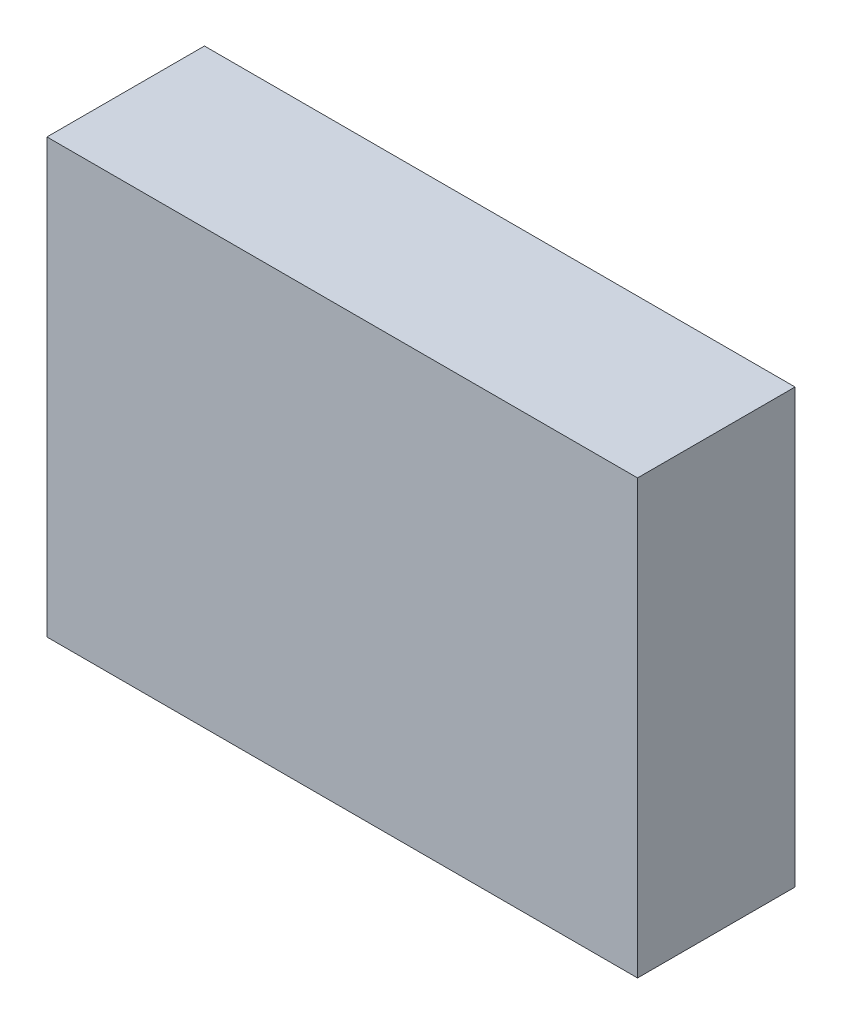
ISO-10303-21;
HEADER;
FILE_DESCRIPTION(('STEP AP214'),'2;1');
FILE_NAME('part.step','',(''),(''),'','','');
FILE_SCHEMA(('AUTOMOTIVE_DESIGN { 1 0 10303 214 1 1 1 1 }'));
ENDSEC;
DATA;
#1=APPLICATION_CONTEXT('core data for automotive mechanical design processes');
#2=APPLICATION_PROTOCOL_DEFINITION('international standard','automotive_design',2000,#1);
#3=PRODUCT_CONTEXT('',#1,'mechanical');
#4=PRODUCT('Part','Part','',(#3));
#5=PRODUCT_RELATED_PRODUCT_CATEGORY('part','',(#4));
#6=PRODUCT_DEFINITION_FORMATION('','',#4);
#7=PRODUCT_DEFINITION_CONTEXT('part definition',#1,'design');
#8=PRODUCT_DEFINITION('design','',#6,#7);
#9=PRODUCT_DEFINITION_SHAPE('','',#8);
#10=(LENGTH_UNIT() NAMED_UNIT(*) SI_UNIT(.MILLI.,.METRE.));
#11=(NAMED_UNIT(*) PLANE_ANGLE_UNIT() SI_UNIT($,.RADIAN.));
#12=(NAMED_UNIT(*) SI_UNIT($,.STERADIAN.) SOLID_ANGLE_UNIT());
#13=UNCERTAINTY_MEASURE_WITH_UNIT(LENGTH_MEASURE(1.E-05),#10,'distance_accuracy_value','');
#14=(GEOMETRIC_REPRESENTATION_CONTEXT(3) GLOBAL_UNCERTAINTY_ASSIGNED_CONTEXT((#13)) GLOBAL_UNIT_ASSIGNED_CONTEXT((#10,
#11,#12)) REPRESENTATION_CONTEXT('',''));
#15=CARTESIAN_POINT('',(0.,0.,0.));
#16=DIRECTION('',(0.,0.,1.));
#17=DIRECTION('',(1.,0.,0.));
#18=AXIS2_PLACEMENT_3D('',#15,#16,#17);
#19=CARTESIAN_POINT('',(-95.,-146.,192.5));
#20=DIRECTION('',(0.,0.,1.));
#21=DIRECTION('',(1.,0.,0.));
#22=AXIS2_PLACEMENT_3D('',#19,#20,#21);
#23=PLANE('',#22);
#24=DIRECTION('',(0.,1.,0.));
#25=VECTOR('',#24,1.);
#26=CARTESIAN_POINT('',(-95.,-146.,192.5));
#27=LINE('',#26,#25);
#28=CARTESIAN_POINT('',(-95.,-146.,192.5));
#29=VERTEX_POINT('',#28);
#30=CARTESIAN_POINT('',(-95.,-124.,192.5));
#31=VERTEX_POINT('',#30);
#32=EDGE_CURVE('E90',#29,#31,#27,.T.);
#33=ORIENTED_EDGE('',*,*,#32,.F.);
#34=DIRECTION('',(1.,0.,0.));
#35=VECTOR('',#34,1.);
#36=CARTESIAN_POINT('',(-95.,-146.,192.5));
#37=LINE('',#36,#35);
#38=CARTESIAN_POINT('',(-65.,-146.,192.5));
#39=VERTEX_POINT('',#38);
#40=EDGE_CURVE('E69',#29,#39,#37,.T.);
#41=ORIENTED_EDGE('',*,*,#40,.T.);
#42=DIRECTION('',(0.,1.,0.));
#43=VECTOR('',#42,1.);
#44=CARTESIAN_POINT('',(-65.,-146.,192.5));
#45=LINE('',#44,#43);
#46=CARTESIAN_POINT('',(-65.,-124.,192.5));
#47=VERTEX_POINT('',#46);
#48=EDGE_CURVE('E84',#39,#47,#45,.T.);
#49=ORIENTED_EDGE('',*,*,#48,.T.);
#50=DIRECTION('',(1.,0.,0.));
#51=VECTOR('',#50,1.);
#52=CARTESIAN_POINT('',(-95.,-124.,192.5));
#53=LINE('',#52,#51);
#54=EDGE_CURVE('E9',#31,#47,#53,.T.);
#55=ORIENTED_EDGE('',*,*,#54,.F.);
#56=EDGE_LOOP('',(#33,#41,#49,#55));
#57=FACE_BOUND('',#56,.T.);
#58=ADVANCED_FACE('F14',(#57),#23,.T.);
#59=CARTESIAN_POINT('',(-95.,-146.,184.5));
#60=DIRECTION('',(0.,0.,1.));
#61=DIRECTION('',(1.,0.,0.));
#62=AXIS2_PLACEMENT_3D('',#59,#60,#61);
#63=PLANE('',#62);
#64=DIRECTION('',(1.,0.,0.));
#65=VECTOR('',#64,1.);
#66=CARTESIAN_POINT('',(-95.,-124.,184.5));
#67=LINE('',#66,#65);
#68=CARTESIAN_POINT('',(-95.,-124.,184.5));
#69=VERTEX_POINT('',#68);
#70=CARTESIAN_POINT('',(-65.,-124.,184.5));
#71=VERTEX_POINT('',#70);
#72=EDGE_CURVE('E25',#69,#71,#67,.T.);
#73=ORIENTED_EDGE('',*,*,#72,.T.);
#74=DIRECTION('',(0.,1.,0.));
#75=VECTOR('',#74,1.);
#76=CARTESIAN_POINT('',(-65.,-146.,184.5));
#77=LINE('',#76,#75);
#78=CARTESIAN_POINT('',(-65.,-146.,184.5));
#79=VERTEX_POINT('',#78);
#80=EDGE_CURVE('E105',#79,#71,#77,.T.);
#81=ORIENTED_EDGE('',*,*,#80,.F.);
#82=DIRECTION('',(1.,0.,0.));
#83=VECTOR('',#82,1.);
#84=CARTESIAN_POINT('',(-95.,-146.,184.5));
#85=LINE('',#84,#83);
#86=CARTESIAN_POINT('',(-95.,-146.,184.5));
#87=VERTEX_POINT('',#86);
#88=EDGE_CURVE('E56',#87,#79,#85,.T.);
#89=ORIENTED_EDGE('',*,*,#88,.F.);
#90=DIRECTION('',(0.,1.,0.));
#91=VECTOR('',#90,1.);
#92=CARTESIAN_POINT('',(-95.,-146.,184.5));
#93=LINE('',#92,#91);
#94=EDGE_CURVE('E91',#87,#69,#93,.T.);
#95=ORIENTED_EDGE('',*,*,#94,.T.);
#96=EDGE_LOOP('',(#73,#81,#89,#95));
#97=FACE_BOUND('',#96,.T.);
#98=ADVANCED_FACE('F120',(#97),#63,.F.);
#99=CARTESIAN_POINT('',(-95.,-124.,184.5));
#100=DIRECTION('',(0.,1.,0.));
#101=DIRECTION('',(1.,0.,0.));
#102=AXIS2_PLACEMENT_3D('',#99,#100,#101);
#103=PLANE('',#102);
#104=ORIENTED_EDGE('',*,*,#72,.F.);
#105=DIRECTION('',(0.,0.,1.));
#106=VECTOR('',#105,1.);
#107=CARTESIAN_POINT('',(-95.,-124.,184.5));
#108=LINE('',#107,#106);
#109=EDGE_CURVE('E95',#69,#31,#108,.T.);
#110=ORIENTED_EDGE('',*,*,#109,.T.);
#111=ORIENTED_EDGE('',*,*,#54,.T.);
#112=DIRECTION('',(0.,0.,1.));
#113=VECTOR('',#112,1.);
#114=CARTESIAN_POINT('',(-65.,-124.,184.5));
#115=LINE('',#114,#113);
#116=EDGE_CURVE('E18',#71,#47,#115,.T.);
#117=ORIENTED_EDGE('',*,*,#116,.F.);
#118=EDGE_LOOP('',(#104,#110,#111,#117));
#119=FACE_BOUND('',#118,.T.);
#120=ADVANCED_FACE('F16',(#119),#103,.T.);
#121=CARTESIAN_POINT('',(-95.,-146.,184.5));
#122=DIRECTION('',(0.,1.,0.));
#123=DIRECTION('',(1.,0.,0.));
#124=AXIS2_PLACEMENT_3D('',#121,#122,#123);
#125=PLANE('',#124);
#126=DIRECTION('',(0.,0.,1.));
#127=VECTOR('',#126,1.);
#128=CARTESIAN_POINT('',(-65.,-146.,184.5));
#129=LINE('',#128,#127);
#130=EDGE_CURVE('E82',#79,#39,#129,.T.);
#131=ORIENTED_EDGE('',*,*,#130,.T.);
#132=ORIENTED_EDGE('',*,*,#40,.F.);
#133=DIRECTION('',(0.,0.,1.));
#134=VECTOR('',#133,1.);
#135=CARTESIAN_POINT('',(-95.,-146.,184.5));
#136=LINE('',#135,#134);
#137=EDGE_CURVE('E79',#87,#29,#136,.T.);
#138=ORIENTED_EDGE('',*,*,#137,.F.);
#139=ORIENTED_EDGE('',*,*,#88,.T.);
#140=EDGE_LOOP('',(#131,#132,#138,#139));
#141=FACE_BOUND('',#140,.T.);
#142=ADVANCED_FACE('F78',(#141),#125,.F.);
#143=CARTESIAN_POINT('',(-65.,-146.,184.5));
#144=DIRECTION('',(1.,0.,0.));
#145=DIRECTION('',(0.,1.,0.));
#146=AXIS2_PLACEMENT_3D('',#143,#144,#145);
#147=PLANE('',#146);
#148=ORIENTED_EDGE('',*,*,#130,.F.);
#149=ORIENTED_EDGE('',*,*,#80,.T.);
#150=ORIENTED_EDGE('',*,*,#116,.T.);
#151=ORIENTED_EDGE('',*,*,#48,.F.);
#152=EDGE_LOOP('',(#148,#149,#150,#151));
#153=FACE_BOUND('',#152,.T.);
#154=ADVANCED_FACE('F119',(#153),#147,.T.);
#155=CARTESIAN_POINT('',(-95.,-146.,184.5));
#156=DIRECTION('',(1.,0.,0.));
#157=DIRECTION('',(0.,1.,0.));
#158=AXIS2_PLACEMENT_3D('',#155,#156,#157);
#159=PLANE('',#158);
#160=ORIENTED_EDGE('',*,*,#32,.T.);
#161=ORIENTED_EDGE('',*,*,#109,.F.);
#162=ORIENTED_EDGE('',*,*,#94,.F.);
#163=ORIENTED_EDGE('',*,*,#137,.T.);
#164=EDGE_LOOP('',(#160,#161,#162,#163));
#165=FACE_BOUND('',#164,.T.);
#166=ADVANCED_FACE('F88',(#165),#159,.F.);
#167=CLOSED_SHELL('',(#58,#98,#120,#142,#154,#166));
#168=MANIFOLD_SOLID_BREP('B1',#167);
#169=ADVANCED_BREP_SHAPE_REPRESENTATION('',(#18,#168),#14);
#170=SHAPE_DEFINITION_REPRESENTATION(#9,#169);
ENDSEC;
END-ISO-10303-21;
